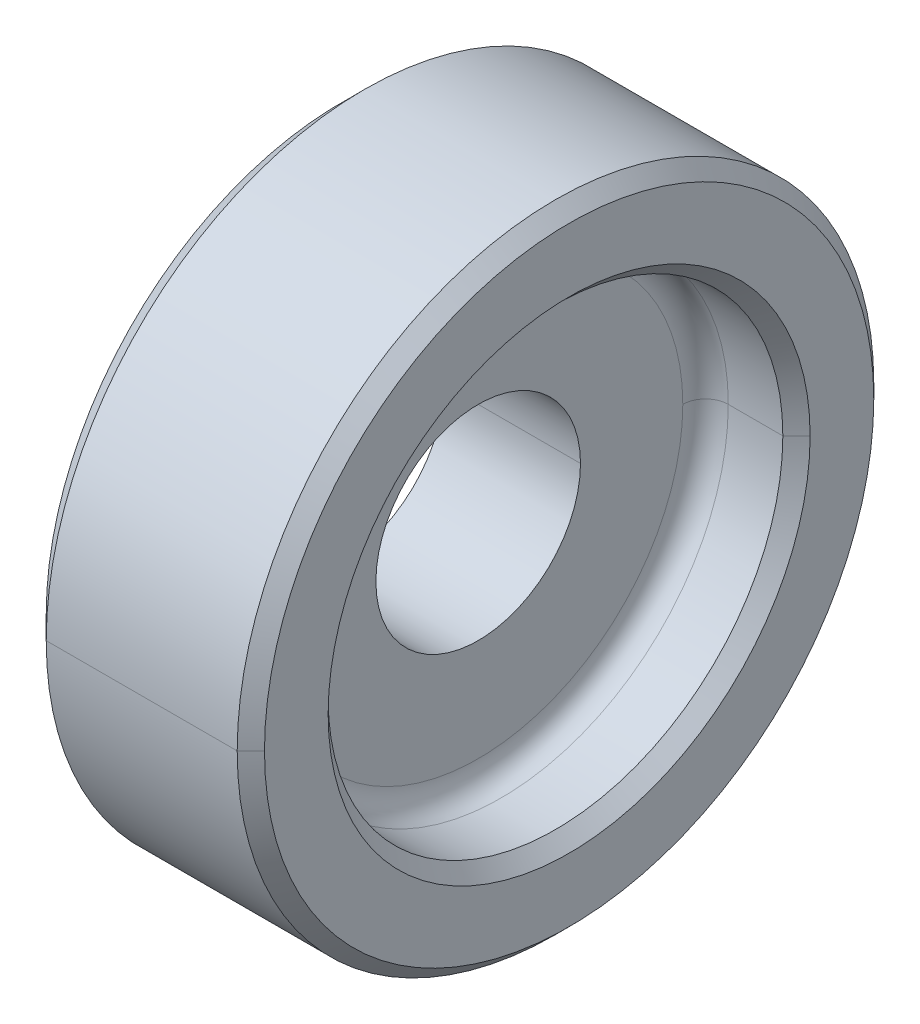
ISO-10303-21;
HEADER;
FILE_DESCRIPTION(('STEP AP214'),'2;1');
FILE_NAME('part.step','',(''),(''),'','','');
FILE_SCHEMA(('AUTOMOTIVE_DESIGN { 1 0 10303 214 1 1 1 1 }'));
ENDSEC;
DATA;
#1=APPLICATION_CONTEXT('core data for automotive mechanical design processes');
#2=APPLICATION_PROTOCOL_DEFINITION('international standard','automotive_design',2000,#1);
#3=PRODUCT_CONTEXT('',#1,'mechanical');
#4=PRODUCT('Part','Part','',(#3));
#5=PRODUCT_RELATED_PRODUCT_CATEGORY('part','',(#4));
#6=PRODUCT_DEFINITION_FORMATION('','',#4);
#7=PRODUCT_DEFINITION_CONTEXT('part definition',#1,'design');
#8=PRODUCT_DEFINITION('design','',#6,#7);
#9=PRODUCT_DEFINITION_SHAPE('','',#8);
#10=(LENGTH_UNIT() NAMED_UNIT(*) SI_UNIT(.MILLI.,.METRE.));
#11=(NAMED_UNIT(*) PLANE_ANGLE_UNIT() SI_UNIT($,.RADIAN.));
#12=(NAMED_UNIT(*) SI_UNIT($,.STERADIAN.) SOLID_ANGLE_UNIT());
#13=UNCERTAINTY_MEASURE_WITH_UNIT(LENGTH_MEASURE(1.E-05),#10,'distance_accuracy_value','');
#14=(GEOMETRIC_REPRESENTATION_CONTEXT(3) GLOBAL_UNCERTAINTY_ASSIGNED_CONTEXT((#13)) GLOBAL_UNIT_ASSIGNED_CONTEXT((#10,
#11,#12)) REPRESENTATION_CONTEXT('',''));
#15=CARTESIAN_POINT('',(0.,0.,0.));
#16=DIRECTION('',(0.,0.,1.));
#17=DIRECTION('',(1.,0.,0.));
#18=AXIS2_PLACEMENT_3D('',#15,#16,#17);
#19=CARTESIAN_POINT('',(0.,6.5,0.));
#20=DIRECTION('',(-1.,0.,0.));
#21=DIRECTION('',(0.,0.,1.));
#22=AXIS2_PLACEMENT_3D('',#19,#20,#21);
#23=PLANE('',#22);
#24=CARTESIAN_POINT('',(0.,0.,0.));
#25=DIRECTION('',(1.,0.,0.));
#26=DIRECTION('',(0.,0.,-1.));
#27=AXIS2_PLACEMENT_3D('',#24,#25,#26);
#28=CIRCLE('',#27,2.25);
#29=CARTESIAN_POINT('',(0.,0.,-2.25));
#30=VERTEX_POINT('',#29);
#31=CARTESIAN_POINT('',(0.,0.,2.25));
#32=VERTEX_POINT('',#31);
#33=EDGE_CURVE('E10',#30,#32,#28,.T.);
#34=ORIENTED_EDGE('',*,*,#33,.T.);
#35=CARTESIAN_POINT('',(0.,0.,0.));
#36=DIRECTION('',(1.,0.,0.));
#37=DIRECTION('',(0.,0.,-1.));
#38=AXIS2_PLACEMENT_3D('',#35,#36,#37);
#39=CIRCLE('',#38,2.25);
#40=EDGE_CURVE('E24',#32,#30,#39,.T.);
#41=ORIENTED_EDGE('',*,*,#40,.T.);
#42=EDGE_LOOP('',(#34,#41));
#43=FACE_BOUND('',#42,.T.);
#44=CARTESIAN_POINT('',(0.,0.,0.));
#45=DIRECTION('',(1.,0.,0.));
#46=DIRECTION('',(0.,0.,-1.));
#47=AXIS2_PLACEMENT_3D('',#44,#45,#46);
#48=CIRCLE('',#47,6.5);
#49=CARTESIAN_POINT('',(0.,0.,-6.5));
#50=VERTEX_POINT('',#49);
#51=CARTESIAN_POINT('',(1.275812788748E-12,0.,6.49999999999872));
#52=VERTEX_POINT('',#51);
#53=EDGE_CURVE('E498',#50,#52,#48,.T.);
#54=ORIENTED_EDGE('',*,*,#53,.F.);
#55=CARTESIAN_POINT('',(0.,0.,0.));
#56=DIRECTION('',(1.,0.,0.));
#57=DIRECTION('',(0.,0.,-1.));
#58=AXIS2_PLACEMENT_3D('',#55,#56,#57);
#59=CIRCLE('',#58,6.5);
#60=EDGE_CURVE('E496',#52,#50,#59,.T.);
#61=ORIENTED_EDGE('',*,*,#60,.F.);
#62=EDGE_LOOP('',(#54,#61));
#63=FACE_BOUND('',#62,.T.);
#64=ADVANCED_FACE('F16',(#43,#63),#23,.T.);
#65=CARTESIAN_POINT('',(0.5,0.,0.));
#66=DIRECTION('',(1.,0.,0.));
#67=DIRECTION('',(0.,1.,0.));
#68=AXIS2_PLACEMENT_3D('',#65,#66,#67);
#69=CONICAL_SURFACE('',#68,7.,0.7853981634);
#70=ORIENTED_EDGE('',*,*,#60,.T.);
#71=CARTESIAN_POINT('',(1.27578069636369E-12,0.,-6.49999999999872));
#72=DIRECTION('',(0.707106781184743,0.,-0.707106781188352));
#73=VECTOR('',#72,1.);
#74=LINE('',#71,#73);
#75=CARTESIAN_POINT('',(0.5,0.,-7.));
#76=VERTEX_POINT('',#75);
#77=EDGE_CURVE('E466',#50,#76,#74,.T.);
#78=ORIENTED_EDGE('',*,*,#77,.T.);
#79=CARTESIAN_POINT('',(0.5,0.,0.));
#80=DIRECTION('',(1.,0.,0.));
#81=DIRECTION('',(0.,0.,-1.));
#82=AXIS2_PLACEMENT_3D('',#79,#80,#81);
#83=CIRCLE('',#82,7.);
#84=CARTESIAN_POINT('',(0.5,0.,7.));
#85=VERTEX_POINT('',#84);
#86=EDGE_CURVE('E483',#85,#76,#83,.T.);
#87=ORIENTED_EDGE('',*,*,#86,.F.);
#88=CARTESIAN_POINT('',(1.27578069636369E-12,0.,6.49999999999872));
#89=DIRECTION('',(0.707106781184743,0.,0.707106781188352));
#90=VECTOR('',#89,1.);
#91=LINE('',#88,#90);
#92=EDGE_CURVE('E468',#52,#85,#91,.T.);
#93=ORIENTED_EDGE('',*,*,#92,.F.);
#94=EDGE_LOOP('',(#70,#78,#87,#93));
#95=FACE_BOUND('',#94,.T.);
#96=ADVANCED_FACE('F450',(#95),#69,.T.);
#97=CARTESIAN_POINT('',(0.5,0.,0.));
#98=DIRECTION('',(1.,0.,0.));
#99=DIRECTION('',(0.,-1.,0.));
#100=AXIS2_PLACEMENT_3D('',#97,#98,#99);
#101=CONICAL_SURFACE('',#100,7.,0.7853981634);
#102=CARTESIAN_POINT('',(0.5,0.,0.));
#103=DIRECTION('',(1.,0.,0.));
#104=DIRECTION('',(0.,0.,-1.));
#105=AXIS2_PLACEMENT_3D('',#102,#103,#104);
#106=CIRCLE('',#105,7.);
#107=EDGE_CURVE('E434',#76,#85,#106,.T.);
#108=ORIENTED_EDGE('',*,*,#107,.F.);
#109=ORIENTED_EDGE('',*,*,#77,.F.);
#110=ORIENTED_EDGE('',*,*,#53,.T.);
#111=ORIENTED_EDGE('',*,*,#92,.T.);
#112=EDGE_LOOP('',(#108,#109,#110,#111));
#113=FACE_BOUND('',#112,.T.);
#114=ADVANCED_FACE('F442',(#113),#101,.T.);
#115=CARTESIAN_POINT('',(5.,0.,0.));
#116=DIRECTION('',(-1.,0.,0.));
#117=DIRECTION('',(0.,-1.,0.));
#118=AXIS2_PLACEMENT_3D('',#115,#116,#117);
#119=CYLINDRICAL_SURFACE('',#118,7.);
#120=CARTESIAN_POINT('',(4.7,0.,0.));
#121=DIRECTION('',(1.,0.,0.));
#122=DIRECTION('',(0.,0.,-1.));
#123=AXIS2_PLACEMENT_3D('',#120,#121,#122);
#124=CIRCLE('',#123,7.);
#125=CARTESIAN_POINT('',(4.7,0.,-7.));
#126=VERTEX_POINT('',#125);
#127=CARTESIAN_POINT('',(4.70000000000077,0.,7.00000000000077));
#128=VERTEX_POINT('',#127);
#129=EDGE_CURVE('E432',#126,#128,#124,.T.);
#130=ORIENTED_EDGE('',*,*,#129,.F.);
#131=CARTESIAN_POINT('',(4.7,0.,-7.));
#132=DIRECTION('',(-1.,0.,0.));
#133=VECTOR('',#132,1.);
#134=LINE('',#131,#133);
#135=EDGE_CURVE('E410',#126,#76,#134,.T.);
#136=ORIENTED_EDGE('',*,*,#135,.T.);
#137=ORIENTED_EDGE('',*,*,#107,.T.);
#138=CARTESIAN_POINT('',(4.7,0.,7.));
#139=DIRECTION('',(-1.,0.,0.));
#140=VECTOR('',#139,1.);
#141=LINE('',#138,#140);
#142=EDGE_CURVE('E422',#128,#85,#141,.T.);
#143=ORIENTED_EDGE('',*,*,#142,.F.);
#144=EDGE_LOOP('',(#130,#136,#137,#143));
#145=FACE_BOUND('',#144,.T.);
#146=ADVANCED_FACE('F389',(#145),#119,.T.);
#147=CARTESIAN_POINT('',(5.,0.,0.));
#148=DIRECTION('',(-1.,0.,0.));
#149=DIRECTION('',(0.,1.,0.));
#150=AXIS2_PLACEMENT_3D('',#147,#148,#149);
#151=CYLINDRICAL_SURFACE('',#150,7.);
#152=ORIENTED_EDGE('',*,*,#86,.T.);
#153=ORIENTED_EDGE('',*,*,#135,.F.);
#154=CARTESIAN_POINT('',(4.7,0.,0.));
#155=DIRECTION('',(1.,0.,0.));
#156=DIRECTION('',(0.,0.,-1.));
#157=AXIS2_PLACEMENT_3D('',#154,#155,#156);
#158=CIRCLE('',#157,7.);
#159=EDGE_CURVE('E705',#128,#126,#158,.T.);
#160=ORIENTED_EDGE('',*,*,#159,.F.);
#161=ORIENTED_EDGE('',*,*,#142,.T.);
#162=EDGE_LOOP('',(#152,#153,#160,#161));
#163=FACE_BOUND('',#162,.T.);
#164=ADVANCED_FACE('F380',(#163),#151,.T.);
#165=CARTESIAN_POINT('',(5.,0.,0.));
#166=DIRECTION('',(-1.,0.,0.));
#167=DIRECTION('',(0.,1.,0.));
#168=AXIS2_PLACEMENT_3D('',#165,#166,#167);
#169=CONICAL_SURFACE('',#168,6.7,0.7853981634);
#170=ORIENTED_EDGE('',*,*,#159,.T.);
#171=CARTESIAN_POINT('',(5.,0.,-6.7));
#172=DIRECTION('',(-0.707106781184742,0.,-0.707106781188353));
#173=VECTOR('',#172,1.);
#174=LINE('',#171,#173);
#175=CARTESIAN_POINT('',(5.,0.,-6.7));
#176=VERTEX_POINT('',#175);
#177=EDGE_CURVE('E343',#176,#126,#174,.T.);
#178=ORIENTED_EDGE('',*,*,#177,.F.);
#179=CARTESIAN_POINT('',(5.,0.,0.));
#180=DIRECTION('',(1.,0.,0.));
#181=DIRECTION('',(0.,0.,-1.));
#182=AXIS2_PLACEMENT_3D('',#179,#180,#181);
#183=CIRCLE('',#182,6.7);
#184=CARTESIAN_POINT('',(5.,0.,6.7));
#185=VERTEX_POINT('',#184);
#186=EDGE_CURVE('E361',#185,#176,#183,.T.);
#187=ORIENTED_EDGE('',*,*,#186,.F.);
#188=CARTESIAN_POINT('',(5.,0.,6.7));
#189=DIRECTION('',(-0.707106781184742,0.,0.707106781188353));
#190=VECTOR('',#189,1.);
#191=LINE('',#188,#190);
#192=EDGE_CURVE('E346',#185,#128,#191,.T.);
#193=ORIENTED_EDGE('',*,*,#192,.T.);
#194=EDGE_LOOP('',(#170,#178,#187,#193));
#195=FACE_BOUND('',#194,.T.);
#196=ADVANCED_FACE('F326',(#195),#169,.T.);
#197=CARTESIAN_POINT('',(5.,0.,0.));
#198=DIRECTION('',(-1.,0.,0.));
#199=DIRECTION('',(0.,-1.,0.));
#200=AXIS2_PLACEMENT_3D('',#197,#198,#199);
#201=CONICAL_SURFACE('',#200,6.7,0.7853981634);
#202=CARTESIAN_POINT('',(5.,0.,0.));
#203=DIRECTION('',(1.,0.,0.));
#204=DIRECTION('',(0.,0.,-1.));
#205=AXIS2_PLACEMENT_3D('',#202,#203,#204);
#206=CIRCLE('',#205,6.7);
#207=EDGE_CURVE('E307',#176,#185,#206,.T.);
#208=ORIENTED_EDGE('',*,*,#207,.F.);
#209=ORIENTED_EDGE('',*,*,#177,.T.);
#210=ORIENTED_EDGE('',*,*,#129,.T.);
#211=ORIENTED_EDGE('',*,*,#192,.F.);
#212=EDGE_LOOP('',(#208,#209,#210,#211));
#213=FACE_BOUND('',#212,.T.);
#214=ADVANCED_FACE('F316',(#213),#201,.T.);
#215=CARTESIAN_POINT('',(5.,5.3,0.));
#216=DIRECTION('',(1.,0.,0.));
#217=DIRECTION('',(0.,0.,-1.));
#218=AXIS2_PLACEMENT_3D('',#215,#216,#217);
#219=PLANE('',#218);
#220=ORIENTED_EDGE('',*,*,#207,.T.);
#221=ORIENTED_EDGE('',*,*,#186,.T.);
#222=EDGE_LOOP('',(#220,#221));
#223=FACE_BOUND('',#222,.T.);
#224=CARTESIAN_POINT('',(5.,0.,0.));
#225=DIRECTION('',(1.,0.,0.));
#226=DIRECTION('',(0.,0.,-1.));
#227=AXIS2_PLACEMENT_3D('',#224,#225,#226);
#228=CIRCLE('',#227,5.3);
#229=CARTESIAN_POINT('',(5.,0.,-5.3));
#230=VERTEX_POINT('',#229);
#231=CARTESIAN_POINT('',(4.99999999999923,0.,5.30000000000077));
#232=VERTEX_POINT('',#231);
#233=EDGE_CURVE('E303',#230,#232,#228,.T.);
#234=ORIENTED_EDGE('',*,*,#233,.F.);
#235=CARTESIAN_POINT('',(5.,0.,0.));
#236=DIRECTION('',(1.,0.,0.));
#237=DIRECTION('',(0.,0.,-1.));
#238=AXIS2_PLACEMENT_3D('',#235,#236,#237);
#239=CIRCLE('',#238,5.3);
#240=EDGE_CURVE('E299',#232,#230,#239,.T.);
#241=ORIENTED_EDGE('',*,*,#240,.F.);
#242=EDGE_LOOP('',(#234,#241));
#243=FACE_BOUND('',#242,.T.);
#244=ADVANCED_FACE('F325',(#223,#243),#219,.T.);
#245=CARTESIAN_POINT('',(4.7,0.,0.));
#246=DIRECTION('',(1.,0.,0.));
#247=DIRECTION('',(0.,1.,0.));
#248=AXIS2_PLACEMENT_3D('',#245,#246,#247);
#249=CONICAL_SURFACE('',#248,5.,0.7853981634);
#250=CARTESIAN_POINT('',(4.7,0.,0.));
#251=DIRECTION('',(1.,0.,0.));
#252=DIRECTION('',(0.,0.,-1.));
#253=AXIS2_PLACEMENT_3D('',#250,#251,#252);
#254=CIRCLE('',#253,5.);
#255=CARTESIAN_POINT('',(4.7,0.,5.));
#256=VERTEX_POINT('',#255);
#257=CARTESIAN_POINT('',(4.7,0.,-5.));
#258=VERTEX_POINT('',#257);
#259=EDGE_CURVE('E297',#256,#258,#254,.T.);
#260=ORIENTED_EDGE('',*,*,#259,.F.);
#261=CARTESIAN_POINT('',(4.7,0.,5.));
#262=DIRECTION('',(0.707106781184742,0.,0.707106781188353));
#263=VECTOR('',#262,1.);
#264=LINE('',#261,#263);
#265=EDGE_CURVE('E275',#256,#232,#264,.T.);
#266=ORIENTED_EDGE('',*,*,#265,.T.);
#267=ORIENTED_EDGE('',*,*,#240,.T.);
#268=CARTESIAN_POINT('',(4.7,0.,-5.));
#269=DIRECTION('',(0.707106781184742,0.,-0.707106781188353));
#270=VECTOR('',#269,1.);
#271=LINE('',#268,#270);
#272=EDGE_CURVE('E287',#258,#230,#271,.T.);
#273=ORIENTED_EDGE('',*,*,#272,.F.);
#274=EDGE_LOOP('',(#260,#266,#267,#273));
#275=FACE_BOUND('',#274,.T.);
#276=ADVANCED_FACE('F254',(#275),#249,.F.);
#277=CARTESIAN_POINT('',(4.7,0.,0.));
#278=DIRECTION('',(1.,0.,0.));
#279=DIRECTION('',(0.,-1.,0.));
#280=AXIS2_PLACEMENT_3D('',#277,#278,#279);
#281=CONICAL_SURFACE('',#280,5.,0.7853981634);
#282=ORIENTED_EDGE('',*,*,#233,.T.);
#283=ORIENTED_EDGE('',*,*,#265,.F.);
#284=CARTESIAN_POINT('',(4.7,0.,0.));
#285=DIRECTION('',(1.,0.,0.));
#286=DIRECTION('',(0.,0.,-1.));
#287=AXIS2_PLACEMENT_3D('',#284,#285,#286);
#288=CIRCLE('',#287,5.);
#289=EDGE_CURVE('E703',#258,#256,#288,.T.);
#290=ORIENTED_EDGE('',*,*,#289,.F.);
#291=ORIENTED_EDGE('',*,*,#272,.T.);
#292=EDGE_LOOP('',(#282,#283,#290,#291));
#293=FACE_BOUND('',#292,.T.);
#294=ADVANCED_FACE('F245',(#293),#281,.F.);
#295=CARTESIAN_POINT('',(5.,0.,0.));
#296=DIRECTION('',(-1.,0.,0.));
#297=DIRECTION('',(0.,-1.,0.));
#298=AXIS2_PLACEMENT_3D('',#295,#296,#297);
#299=CYLINDRICAL_SURFACE('',#298,5.);
#300=ORIENTED_EDGE('',*,*,#289,.T.);
#301=CARTESIAN_POINT('',(4.7,0.,5.));
#302=DIRECTION('',(-1.,0.,0.));
#303=VECTOR('',#302,1.);
#304=LINE('',#301,#303);
#305=CARTESIAN_POINT('',(3.49999999999991,0.,5.));
#306=VERTEX_POINT('',#305);
#307=EDGE_CURVE('E210',#256,#306,#304,.T.);
#308=ORIENTED_EDGE('',*,*,#307,.T.);
#309=CARTESIAN_POINT('',(3.5,0.,0.));
#310=DIRECTION('',(1.,0.,0.));
#311=DIRECTION('',(0.,0.,-1.));
#312=AXIS2_PLACEMENT_3D('',#309,#310,#311);
#313=CIRCLE('',#312,5.);
#314=CARTESIAN_POINT('',(3.5,0.,-5.));
#315=VERTEX_POINT('',#314);
#316=EDGE_CURVE('E227',#315,#306,#313,.T.);
#317=ORIENTED_EDGE('',*,*,#316,.F.);
#318=CARTESIAN_POINT('',(4.7,0.,-5.));
#319=DIRECTION('',(-1.,0.,0.));
#320=VECTOR('',#319,1.);
#321=LINE('',#318,#320);
#322=EDGE_CURVE('E212',#258,#315,#321,.T.);
#323=ORIENTED_EDGE('',*,*,#322,.F.);
#324=EDGE_LOOP('',(#300,#308,#317,#323));
#325=FACE_BOUND('',#324,.T.);
#326=ADVANCED_FACE('F193',(#325),#299,.F.);
#327=CARTESIAN_POINT('',(5.,0.,0.));
#328=DIRECTION('',(-1.,0.,0.));
#329=DIRECTION('',(0.,1.,0.));
#330=AXIS2_PLACEMENT_3D('',#327,#328,#329);
#331=CYLINDRICAL_SURFACE('',#330,5.);
#332=CARTESIAN_POINT('',(3.5,0.,0.));
#333=DIRECTION('',(1.,0.,0.));
#334=DIRECTION('',(0.,0.,-1.));
#335=AXIS2_PLACEMENT_3D('',#332,#333,#334);
#336=CIRCLE('',#335,5.);
#337=EDGE_CURVE('E176',#306,#315,#336,.T.);
#338=ORIENTED_EDGE('',*,*,#337,.F.);
#339=ORIENTED_EDGE('',*,*,#307,.F.);
#340=ORIENTED_EDGE('',*,*,#259,.T.);
#341=ORIENTED_EDGE('',*,*,#322,.T.);
#342=EDGE_LOOP('',(#338,#339,#340,#341));
#343=FACE_BOUND('',#342,.T.);
#344=ADVANCED_FACE('F184',(#343),#331,.F.);
#345=CARTESIAN_POINT('',(3.49999999999991,0.,0.));
#346=DIRECTION('',(1.,0.,0.));
#347=DIRECTION('',(0.,1.,0.));
#348=AXIS2_PLACEMENT_3D('',#345,#346,#347);
#349=TOROIDAL_SURFACE('',#348,4.5,0.5);
#350=CARTESIAN_POINT('',(3.,0.,0.));
#351=DIRECTION('',(1.,0.,0.));
#352=DIRECTION('',(0.,0.,-1.));
#353=AXIS2_PLACEMENT_3D('',#350,#351,#352);
#354=CIRCLE('',#353,4.5);
#355=CARTESIAN_POINT('',(2.99999999999991,0.,4.5));
#356=VERTEX_POINT('',#355);
#357=CARTESIAN_POINT('',(3.,0.,-4.5));
#358=VERTEX_POINT('',#357);
#359=EDGE_CURVE('E173',#356,#358,#354,.T.);
#360=ORIENTED_EDGE('',*,*,#359,.F.);
#361=CARTESIAN_POINT('',(2.99999999999991,0.,4.5));
#362=CARTESIAN_POINT('',(2.99999982645552,0.,4.50818123913044));
#363=CARTESIAN_POINT('',(3.00020079143733,0.,4.51636246349396));
#364=CARTESIAN_POINT('',(3.00100375235731,0.,4.53270521083345));
#365=CARTESIAN_POINT('',(3.00160574829548,0.,4.54086673380942));
#366=CARTESIAN_POINT('',(3.00320952503214,0.,4.55715040652013));
#367=CARTESIAN_POINT('',(3.00421130583063,0.,4.56527255625487));
#368=CARTESIAN_POINT('',(3.00661218420441,0.,4.58145791820049));
#369=CARTESIAN_POINT('',(3.00801128177971,0.,4.58952113041139));
#370=CARTESIAN_POINT('',(3.01120343781688,0.,4.60556919160474));
#371=CARTESIAN_POINT('',(3.01299649627876,0.,4.6135540405872));
#372=CARTESIAN_POINT('',(3.01697225052651,0.,4.62942613931606));
#373=CARTESIAN_POINT('',(3.01915494631239,0.,4.63731338906246));
#374=CARTESIAN_POINT('',(3.02390471795522,0.,4.652971288192));
#375=CARTESIAN_POINT('',(3.02647179381218,0.,4.66074193757515));
#376=CARTESIAN_POINT('',(3.03198414100461,0.,4.67614791581706));
#377=CARTESIAN_POINT('',(3.03492941234008,0.,4.68378324467583));
#378=CARTESIAN_POINT('',(3.04119105514845,0.,4.69890018768926));
#379=CARTESIAN_POINT('',(3.04450742662136,0.,4.70638180184392));
#380=CARTESIAN_POINT('',(3.05150328025501,0.,4.72117329158635));
#381=CARTESIAN_POINT('',(3.05518276241576,0.,4.72848316717411));
#382=CARTESIAN_POINT('',(3.0628959732357,0.,4.74291356965188));
#383=CARTESIAN_POINT('',(3.0669297018949,0.,4.7500340965419));
#384=CARTESIAN_POINT('',(3.07534168810464,0.,4.76406864765131));
#385=CARTESIAN_POINT('',(3.07971994565519,0.,4.7709826718707));
#386=CARTESIAN_POINT('',(3.08881044204208,0.,4.78458756114889));
#387=CARTESIAN_POINT('',(3.09352268087843,0.,4.79127842620769));
#388=CARTESIAN_POINT('',(3.10326978764074,0.,4.80442087828473));
#389=CARTESIAN_POINT('',(3.10830465556669,0.,4.81087246530297));
#390=CARTESIAN_POINT('',(3.11868489107039,0.,4.82352081886067));
#391=CARTESIAN_POINT('',(3.12403025864814,0.,4.82971758540013));
#392=CARTESIAN_POINT('',(3.13501861599672,0.,4.84184136944689));
#393=CARTESIAN_POINT('',(3.14066160576756,0.,4.8477683869542));
#394=CARTESIAN_POINT('',(3.15223161304571,0.,4.85933839423234));
#395=CARTESIAN_POINT('',(3.15815863055302,0.,4.86498138400318));
#396=CARTESIAN_POINT('',(3.17028241459978,0.,4.87596974135177));
#397=CARTESIAN_POINT('',(3.17647918113924,0.,4.88131510892952));
#398=CARTESIAN_POINT('',(3.18912753469693,0.,4.89169534443322));
#399=CARTESIAN_POINT('',(3.19557912171517,0.,4.89673021235917));
#400=CARTESIAN_POINT('',(3.20872157379221,0.,4.90647731912147));
#401=CARTESIAN_POINT('',(3.21541243885101,0.,4.91118955795782));
#402=CARTESIAN_POINT('',(3.2290173281292,0.,4.92028005434472));
#403=CARTESIAN_POINT('',(3.23593135234859,0.,4.92465831189526));
#404=CARTESIAN_POINT('',(3.249965903458,0.,4.93307029810501));
#405=CARTESIAN_POINT('',(3.25708643034802,0.,4.9371040267642));
#406=CARTESIAN_POINT('',(3.2715168328258,0.,4.94481723758415));
#407=CARTESIAN_POINT('',(3.27882670841355,0.,4.94849671974489));
#408=CARTESIAN_POINT('',(3.29361819815598,0.,4.95549257337855));
#409=CARTESIAN_POINT('',(3.30109981231065,0.,4.95880894485146));
#410=CARTESIAN_POINT('',(3.31621675532408,0.,4.96507058765983));
#411=CARTESIAN_POINT('',(3.32385208418284,0.,4.96801585899529));
#412=CARTESIAN_POINT('',(3.33925806242475,0.,4.97352820618772));
#413=CARTESIAN_POINT('',(3.3470287118079,0.,4.97609528204469));
#414=CARTESIAN_POINT('',(3.36268661093745,0.,4.98084505368752));
#415=CARTESIAN_POINT('',(3.37057386068385,0.,4.9830277494734));
#416=CARTESIAN_POINT('',(3.3864459594127,0.,4.98700350372115));
#417=CARTESIAN_POINT('',(3.39443080839517,0.,4.98879656218303));
#418=CARTESIAN_POINT('',(3.41047886958852,0.,4.9919887182202));
#419=CARTESIAN_POINT('',(3.41854208179941,0.,4.9933878157955));
#420=CARTESIAN_POINT('',(3.43472744374504,0.,4.99578869416928));
#421=CARTESIAN_POINT('',(3.44284959347977,0.,4.99679047496777));
#422=CARTESIAN_POINT('',(3.45913326619048,0.,4.99839425170443));
#423=CARTESIAN_POINT('',(3.46729478916645,0.,4.9989962476426));
#424=CARTESIAN_POINT('',(3.48363753650594,0.,4.99979920856258));
#425=CARTESIAN_POINT('',(3.49181876086946,0.,5.00000017354439));
#426=CARTESIAN_POINT('',(3.49999999999991,0.,5.));
#427=B_SPLINE_CURVE_WITH_KNOTS('',3,(#361,#362,#363,#364,#365,#366,#367,#368,#369,#370,#371,
#372,#373,#374,#375,#376,#377,#378,#379,#380,#381,#382,#383,#384,#385,#386,#387,#388,#389,#390,
#391,#392,#393,#394,#395,#396,#397,#398,#399,#400,#401,#402,#403,#404,#405,#406,#407,#408,#409,
#410,#411,#412,#413,#414,#415,#416,#417,#418,#419,#420,#421,#422,#423,#424,#425,#426),
.UNSPECIFIED.,.F.,.F.,(4,2,2,2,2,2,2,2,2,2,2,2,2,2,2,2,2,2,2,2,2,2,2,2,2,2,2,2,2,2,2,2,4),(0.,
0.0245412285229125,0.0490824570458248,0.0736236855687376,0.0981649140916496,0.122706142614562,
0.147247371137474,0.171788599660387,0.196329828183298,0.22087105670621,0.245412285229123,
0.269953513752036,0.294494742274948,0.31903597079786,0.343577199320772,0.368118427843684,
0.392659656366596,0.417200884889509,0.441742113412421,0.466283341935334,0.490824570458246,
0.515365798981158,0.53990702750407,0.564448256026983,0.588989484549895,0.613530713072807,
0.63807194159572,0.662613170118632,0.687154398641544,0.711695627164456,0.736236855687368,
0.760778084210281,0.785319312733193),.UNSPECIFIED.);
#428=EDGE_CURVE('E152',#356,#306,#427,.T.);
#429=ORIENTED_EDGE('',*,*,#428,.T.);
#430=ORIENTED_EDGE('',*,*,#337,.T.);
#431=CARTESIAN_POINT('',(2.99999999999991,0.,-4.5));
#432=CARTESIAN_POINT('',(2.99999982645552,0.,-4.50818123913044));
#433=CARTESIAN_POINT('',(3.00020079143733,0.,-4.51636246349396));
#434=CARTESIAN_POINT('',(3.00100375235731,0.,-4.53270521083345));
#435=CARTESIAN_POINT('',(3.00160574829548,0.,-4.54086673380943));
#436=CARTESIAN_POINT('',(3.00320952503214,0.,-4.55715040652013));
#437=CARTESIAN_POINT('',(3.00421130583063,0.,-4.56527255625487));
#438=CARTESIAN_POINT('',(3.00661218420441,0.,-4.58145791820049));
#439=CARTESIAN_POINT('',(3.00801128177971,0.,-4.58952113041139));
#440=CARTESIAN_POINT('',(3.01120343781688,0.,-4.60556919160474));
#441=CARTESIAN_POINT('',(3.01299649627876,0.,-4.6135540405872));
#442=CARTESIAN_POINT('',(3.01697225052651,0.,-4.62942613931606));
#443=CARTESIAN_POINT('',(3.01915494631239,0.,-4.63731338906246));
#444=CARTESIAN_POINT('',(3.02390471795522,0.,-4.652971288192));
#445=CARTESIAN_POINT('',(3.02647179381218,0.,-4.66074193757515));
#446=CARTESIAN_POINT('',(3.03198414100461,0.,-4.67614791581707));
#447=CARTESIAN_POINT('',(3.03492941234008,0.,-4.68378324467583));
#448=CARTESIAN_POINT('',(3.04119105514845,0.,-4.69890018768926));
#449=CARTESIAN_POINT('',(3.04450742662136,0.,-4.70638180184393));
#450=CARTESIAN_POINT('',(3.05150328025501,0.,-4.72117329158635));
#451=CARTESIAN_POINT('',(3.05518276241576,0.,-4.72848316717411));
#452=CARTESIAN_POINT('',(3.0628959732357,0.,-4.74291356965189));
#453=CARTESIAN_POINT('',(3.0669297018949,0.,-4.7500340965419));
#454=CARTESIAN_POINT('',(3.07534168810464,0.,-4.76406864765131));
#455=CARTESIAN_POINT('',(3.07971994565519,0.,-4.7709826718707));
#456=CARTESIAN_POINT('',(3.08881044204208,0.,-4.7845875611489));
#457=CARTESIAN_POINT('',(3.09352268087843,0.,-4.7912784262077));
#458=CARTESIAN_POINT('',(3.10326978764074,0.,-4.80442087828474));
#459=CARTESIAN_POINT('',(3.10830465556669,0.,-4.81087246530297));
#460=CARTESIAN_POINT('',(3.11868489107039,0.,-4.82352081886067));
#461=CARTESIAN_POINT('',(3.12403025864814,0.,-4.82971758540013));
#462=CARTESIAN_POINT('',(3.13501861599672,0.,-4.84184136944689));
#463=CARTESIAN_POINT('',(3.14066160576756,0.,-4.8477683869542));
#464=CARTESIAN_POINT('',(3.15223161304571,0.,-4.85933839423235));
#465=CARTESIAN_POINT('',(3.15815863055302,0.,-4.86498138400319));
#466=CARTESIAN_POINT('',(3.17028241459978,0.,-4.87596974135177));
#467=CARTESIAN_POINT('',(3.17647918113924,0.,-4.88131510892952));
#468=CARTESIAN_POINT('',(3.18912753469693,0.,-4.89169534443322));
#469=CARTESIAN_POINT('',(3.19557912171517,0.,-4.89673021235917));
#470=CARTESIAN_POINT('',(3.20872157379221,0.,-4.90647731912147));
#471=CARTESIAN_POINT('',(3.21541243885101,0.,-4.91118955795782));
#472=CARTESIAN_POINT('',(3.2290173281292,0.,-4.92028005434472));
#473=CARTESIAN_POINT('',(3.23593135234859,0.,-4.92465831189526));
#474=CARTESIAN_POINT('',(3.249965903458,0.,-4.93307029810501));
#475=CARTESIAN_POINT('',(3.25708643034802,0.,-4.9371040267642));
#476=CARTESIAN_POINT('',(3.2715168328258,0.,-4.94481723758415));
#477=CARTESIAN_POINT('',(3.27882670841355,0.,-4.94849671974489));
#478=CARTESIAN_POINT('',(3.29361819815598,0.,-4.95549257337855));
#479=CARTESIAN_POINT('',(3.30109981231065,0.,-4.95880894485146));
#480=CARTESIAN_POINT('',(3.31621675532408,0.,-4.96507058765983));
#481=CARTESIAN_POINT('',(3.32385208418284,0.,-4.96801585899529));
#482=CARTESIAN_POINT('',(3.33925806242475,0.,-4.97352820618772));
#483=CARTESIAN_POINT('',(3.3470287118079,0.,-4.97609528204469));
#484=CARTESIAN_POINT('',(3.36268661093745,0.,-4.98084505368752));
#485=CARTESIAN_POINT('',(3.37057386068385,0.,-4.9830277494734));
#486=CARTESIAN_POINT('',(3.3864459594127,0.,-4.98700350372115));
#487=CARTESIAN_POINT('',(3.39443080839517,0.,-4.98879656218303));
#488=CARTESIAN_POINT('',(3.41047886958852,0.,-4.9919887182202));
#489=CARTESIAN_POINT('',(3.41854208179941,0.,-4.9933878157955));
#490=CARTESIAN_POINT('',(3.43472744374504,0.,-4.99578869416928));
#491=CARTESIAN_POINT('',(3.44284959347977,0.,-4.99679047496777));
#492=CARTESIAN_POINT('',(3.45913326619048,0.,-4.99839425170443));
#493=CARTESIAN_POINT('',(3.46729478916645,0.,-4.9989962476426));
#494=CARTESIAN_POINT('',(3.48363753650594,0.,-4.99979920856258));
#495=CARTESIAN_POINT('',(3.49181876086946,0.,-5.00000017354439));
#496=CARTESIAN_POINT('',(3.49999999999991,0.,-5.));
#497=B_SPLINE_CURVE_WITH_KNOTS('',3,(#431,#432,#433,#434,#435,#436,#437,#438,#439,#440,#441,
#442,#443,#444,#445,#446,#447,#448,#449,#450,#451,#452,#453,#454,#455,#456,#457,#458,#459,#460,
#461,#462,#463,#464,#465,#466,#467,#468,#469,#470,#471,#472,#473,#474,#475,#476,#477,#478,#479,
#480,#481,#482,#483,#484,#485,#486,#487,#488,#489,#490,#491,#492,#493,#494,#495,#496),
.UNSPECIFIED.,.F.,.F.,(4,2,2,2,2,2,2,2,2,2,2,2,2,2,2,2,2,2,2,2,2,2,2,2,2,2,2,2,2,2,2,2,4),(0.,
0.0245412285229125,0.0490824570458248,0.0736236855687368,0.0981649140916496,0.122706142614562,
0.147247371137474,0.171788599660387,0.196329828183298,0.220871056706211,0.245412285229123,
0.269953513752035,0.294494742274948,0.31903597079786,0.343577199320772,0.368118427843684,
0.392659656366596,0.417200884889509,0.441742113412422,0.466283341935333,0.490824570458246,
0.515365798981158,0.53990702750407,0.564448256026982,0.588989484549895,0.613530713072807,
0.638071941595719,0.662613170118631,0.687154398641543,0.711695627164456,0.736236855687368,
0.76077808421028,0.785319312733193),.UNSPECIFIED.);
#498=EDGE_CURVE('E108',#358,#315,#497,.T.);
#499=ORIENTED_EDGE('',*,*,#498,.F.);
#500=EDGE_LOOP('',(#360,#429,#430,#499));
#501=FACE_BOUND('',#500,.T.);
#502=ADVANCED_FACE('F130',(#501),#349,.F.);
#503=CARTESIAN_POINT('',(3.49999999999991,0.,0.));
#504=DIRECTION('',(1.,0.,0.));
#505=DIRECTION('',(0.,-1.,0.));
#506=AXIS2_PLACEMENT_3D('',#503,#504,#505);
#507=TOROIDAL_SURFACE('',#506,4.5,0.5);
#508=ORIENTED_EDGE('',*,*,#316,.T.);
#509=ORIENTED_EDGE('',*,*,#428,.F.);
#510=CARTESIAN_POINT('',(3.,0.,0.));
#511=DIRECTION('',(1.,0.,0.));
#512=DIRECTION('',(0.,0.,-1.));
#513=AXIS2_PLACEMENT_3D('',#510,#511,#512);
#514=CIRCLE('',#513,4.5);
#515=EDGE_CURVE('E105',#358,#356,#514,.T.);
#516=ORIENTED_EDGE('',*,*,#515,.F.);
#517=ORIENTED_EDGE('',*,*,#498,.T.);
#518=EDGE_LOOP('',(#508,#509,#516,#517));
#519=FACE_BOUND('',#518,.T.);
#520=ADVANCED_FACE('F120',(#519),#507,.F.);
#521=CARTESIAN_POINT('',(3.,2.25,0.));
#522=DIRECTION('',(1.,0.,0.));
#523=DIRECTION('',(0.,0.,-1.));
#524=AXIS2_PLACEMENT_3D('',#521,#522,#523);
#525=PLANE('',#524);
#526=ORIENTED_EDGE('',*,*,#515,.T.);
#527=ORIENTED_EDGE('',*,*,#359,.T.);
#528=EDGE_LOOP('',(#526,#527));
#529=FACE_BOUND('',#528,.T.);
#530=CARTESIAN_POINT('',(3.,0.,0.));
#531=DIRECTION('',(1.,0.,0.));
#532=DIRECTION('',(0.,0.,-1.));
#533=AXIS2_PLACEMENT_3D('',#530,#531,#532);
#534=CIRCLE('',#533,2.25);
#535=CARTESIAN_POINT('',(3.,0.,-2.25));
#536=VERTEX_POINT('',#535);
#537=CARTESIAN_POINT('',(3.,0.,2.25));
#538=VERTEX_POINT('',#537);
#539=EDGE_CURVE('E91',#536,#538,#534,.T.);
#540=ORIENTED_EDGE('',*,*,#539,.F.);
#541=CARTESIAN_POINT('',(3.,0.,0.));
#542=DIRECTION('',(1.,0.,0.));
#543=DIRECTION('',(0.,0.,-1.));
#544=AXIS2_PLACEMENT_3D('',#541,#542,#543);
#545=CIRCLE('',#544,2.25);
#546=EDGE_CURVE('E87',#538,#536,#545,.T.);
#547=ORIENTED_EDGE('',*,*,#546,.F.);
#548=EDGE_LOOP('',(#540,#547));
#549=FACE_BOUND('',#548,.T.);
#550=ADVANCED_FACE('F89',(#529,#549),#525,.T.);
#551=CARTESIAN_POINT('',(5.,0.,0.));
#552=DIRECTION('',(-1.,0.,0.));
#553=DIRECTION('',(0.,1.,0.));
#554=AXIS2_PLACEMENT_3D('',#551,#552,#553);
#555=CYLINDRICAL_SURFACE('',#554,2.25);
#556=ORIENTED_EDGE('',*,*,#40,.F.);
#557=CARTESIAN_POINT('',(3.,0.,2.25));
#558=DIRECTION('',(-1.,0.,0.));
#559=VECTOR('',#558,1.);
#560=LINE('',#557,#559);
#561=EDGE_CURVE('E94',#538,#32,#560,.T.);
#562=ORIENTED_EDGE('',*,*,#561,.F.);
#563=ORIENTED_EDGE('',*,*,#546,.T.);
#564=CARTESIAN_POINT('',(3.,0.,-2.25));
#565=DIRECTION('',(-1.,0.,0.));
#566=VECTOR('',#565,1.);
#567=LINE('',#564,#566);
#568=EDGE_CURVE('E101',#536,#30,#567,.T.);
#569=ORIENTED_EDGE('',*,*,#568,.T.);
#570=EDGE_LOOP('',(#556,#562,#563,#569));
#571=FACE_BOUND('',#570,.T.);
#572=ADVANCED_FACE('F98',(#571),#555,.F.);
#573=CARTESIAN_POINT('',(5.,0.,0.));
#574=DIRECTION('',(-1.,0.,0.));
#575=DIRECTION('',(0.,-1.,0.));
#576=AXIS2_PLACEMENT_3D('',#573,#574,#575);
#577=CYLINDRICAL_SURFACE('',#576,2.25);
#578=ORIENTED_EDGE('',*,*,#539,.T.);
#579=ORIENTED_EDGE('',*,*,#561,.T.);
#580=ORIENTED_EDGE('',*,*,#33,.F.);
#581=ORIENTED_EDGE('',*,*,#568,.F.);
#582=EDGE_LOOP('',(#578,#579,#580,#581));
#583=FACE_BOUND('',#582,.T.);
#584=ADVANCED_FACE('F103',(#583),#577,.F.);
#585=CLOSED_SHELL('',(#64,#96,#114,#146,#164,#196,#214,#244,#276,#294,#326,#344,#502,#520,#550,
#572,#584));
#586=MANIFOLD_SOLID_BREP('B1',#585);
#587=ADVANCED_BREP_SHAPE_REPRESENTATION('',(#18,#586),#14);
#588=SHAPE_DEFINITION_REPRESENTATION(#9,#587);
ENDSEC;
END-ISO-10303-21;
